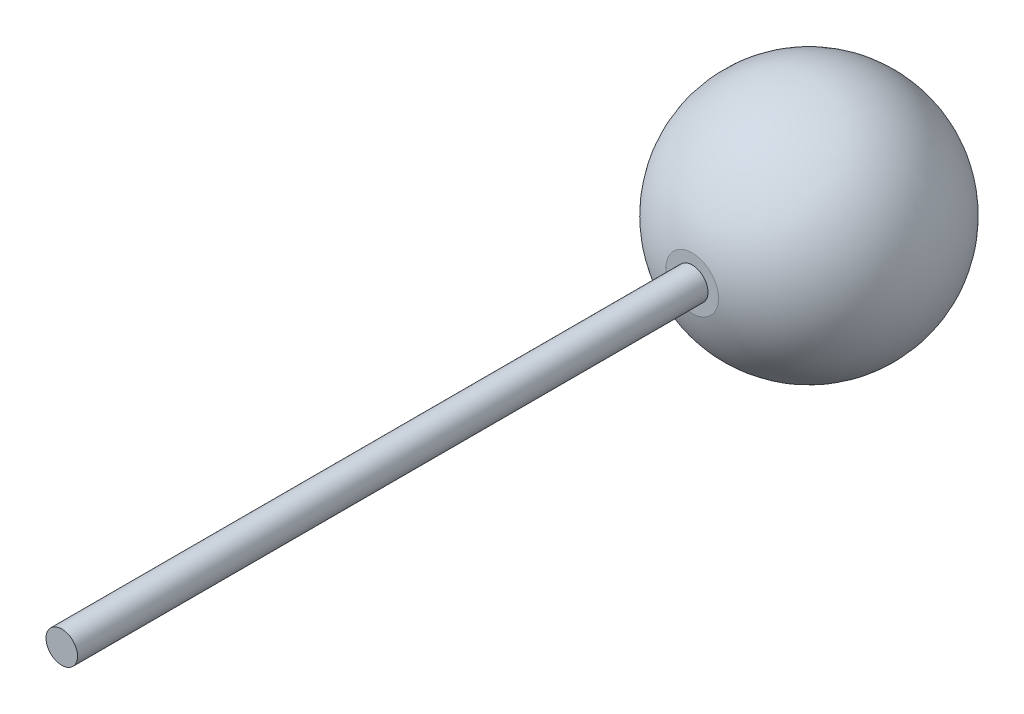
ISO-10303-21;
HEADER;
FILE_DESCRIPTION(('STEP AP214'),'2;1');
FILE_NAME('part.step','',(''),(''),'','','');
FILE_SCHEMA(('AUTOMOTIVE_DESIGN { 1 0 10303 214 1 1 1 1 }'));
ENDSEC;
DATA;
#1=APPLICATION_CONTEXT('core data for automotive mechanical design processes');
#2=APPLICATION_PROTOCOL_DEFINITION('international standard','automotive_design',2000,#1);
#3=PRODUCT_CONTEXT('',#1,'mechanical');
#4=PRODUCT('Part','Part','',(#3));
#5=PRODUCT_RELATED_PRODUCT_CATEGORY('part','',(#4));
#6=PRODUCT_DEFINITION_FORMATION('','',#4);
#7=PRODUCT_DEFINITION_CONTEXT('part definition',#1,'design');
#8=PRODUCT_DEFINITION('design','',#6,#7);
#9=PRODUCT_DEFINITION_SHAPE('','',#8);
#10=(LENGTH_UNIT() NAMED_UNIT(*) SI_UNIT(.MILLI.,.METRE.));
#11=(NAMED_UNIT(*) PLANE_ANGLE_UNIT() SI_UNIT($,.RADIAN.));
#12=(NAMED_UNIT(*) SI_UNIT($,.STERADIAN.) SOLID_ANGLE_UNIT());
#13=UNCERTAINTY_MEASURE_WITH_UNIT(LENGTH_MEASURE(1.E-05),#10,'distance_accuracy_value','');
#14=(GEOMETRIC_REPRESENTATION_CONTEXT(3) GLOBAL_UNCERTAINTY_ASSIGNED_CONTEXT((#13)) GLOBAL_UNIT_ASSIGNED_CONTEXT((#10,
#11,#12)) REPRESENTATION_CONTEXT('',''));
#15=CARTESIAN_POINT('',(0.,0.,0.));
#16=DIRECTION('',(0.,0.,1.));
#17=DIRECTION('',(1.,0.,0.));
#18=AXIS2_PLACEMENT_3D('',#15,#16,#17);
#19=CARTESIAN_POINT('',(0.000503654804633703,0.,-5.64438848279949));
#20=DIRECTION('',(0.,-1.,0.));
#21=DIRECTION('',(-1.,0.,0.));
#22=AXIS2_PLACEMENT_3D('',#19,#20,#21);
#23=CIRCLE('',#22,5.78561153912284);
#24=TRIMMED_CURVE('',#23,(PARAMETER_VALUE(-1.57070927380113)),
(PARAMETER_VALUE(1.57070927380113)),.T.,.PARAMETER.);
#25=CARTESIAN_POINT('',(0.,0.,-5.64438848279949));
#26=DIRECTION('',(0.,0.,-1.));
#27=AXIS1_PLACEMENT('',#25,#26);
#28=SURFACE_OF_REVOLUTION('',#24,#27);
#29=CARTESIAN_POINT('',(0.,0.,-11.43));
#30=VERTEX_POINT('',#29);
#31=VERTEX_LOOP('',#30);
#32=FACE_BOUND('',#31,.T.);
#33=CARTESIAN_POINT('',(0.,0.,0.));
#34=DIRECTION('',(0.,0.,-1.));
#35=DIRECTION('',(-1.,0.,0.));
#36=AXIS2_PLACEMENT_3D('',#33,#34,#35);
#37=CIRCLE('',#36,1.27);
#38=CARTESIAN_POINT('',(-1.27,0.,0.));
#39=VERTEX_POINT('',#38);
#40=EDGE_CURVE('E53',#39,#39,#37,.T.);
#41=ORIENTED_EDGE('',*,*,#40,.T.);
#42=EDGE_LOOP('',(#41));
#43=FACE_BOUND('',#42,.T.);
#44=ADVANCED_FACE('F47',(#32,#43),#28,.T.);
#45=CARTESIAN_POINT('',(0.,0.,0.));
#46=DIRECTION('',(0.,0.,-1.));
#47=DIRECTION('',(-1.,0.,0.));
#48=AXIS2_PLACEMENT_3D('',#45,#46,#47);
#49=PLANE('',#48);
#50=CARTESIAN_POINT('',(0.,0.,0.));
#51=DIRECTION('',(0.,0.,-1.));
#52=DIRECTION('',(-1.,0.,0.));
#53=AXIS2_PLACEMENT_3D('',#50,#51,#52);
#54=CIRCLE('',#53,0.762);
#55=CARTESIAN_POINT('',(-0.762,0.,0.));
#56=VERTEX_POINT('',#55);
#57=EDGE_CURVE('E11',#56,#56,#54,.F.);
#58=ORIENTED_EDGE('',*,*,#57,.F.);
#59=EDGE_LOOP('',(#58));
#60=FACE_BOUND('',#59,.T.);
#61=ORIENTED_EDGE('',*,*,#40,.F.);
#62=EDGE_LOOP('',(#61));
#63=FACE_BOUND('',#62,.T.);
#64=ADVANCED_FACE('F58',(#60,#63),#49,.F.);
#65=CARTESIAN_POINT('',(0.,0.,30.48));
#66=DIRECTION('',(0.,0.,-1.));
#67=DIRECTION('',(-1.,0.,0.));
#68=AXIS2_PLACEMENT_3D('',#65,#66,#67);
#69=CYLINDRICAL_SURFACE('',#68,0.762);
#70=CARTESIAN_POINT('',(0.,0.,30.48));
#71=DIRECTION('',(0.,0.,1.));
#72=DIRECTION('',(1.,0.,0.));
#73=AXIS2_PLACEMENT_3D('',#70,#71,#72);
#74=CIRCLE('',#73,0.762);
#75=CARTESIAN_POINT('',(-0.762,0.,30.48));
#76=VERTEX_POINT('',#75);
#77=EDGE_CURVE('E62',#76,#76,#74,.T.);
#78=CARTESIAN_POINT('',(-0.762,0.,30.48));
#79=CARTESIAN_POINT('',(-0.762,0.,30.1625));
#80=CARTESIAN_POINT('',(-0.762,0.,29.845));
#81=CARTESIAN_POINT('',(-0.762,0.,29.21));
#82=CARTESIAN_POINT('',(-0.762,0.,28.8925));
#83=CARTESIAN_POINT('',(-0.762,0.,28.2575));
#84=CARTESIAN_POINT('',(-0.762,0.,27.94));
#85=CARTESIAN_POINT('',(-0.762,0.,27.305));
#86=CARTESIAN_POINT('',(-0.762,0.,26.9875));
#87=CARTESIAN_POINT('',(-0.762,0.,26.3525));
#88=CARTESIAN_POINT('',(-0.762,0.,26.035));
#89=CARTESIAN_POINT('',(-0.762,0.,25.4));
#90=CARTESIAN_POINT('',(-0.762,0.,25.0825));
#91=CARTESIAN_POINT('',(-0.762,0.,24.4475));
#92=CARTESIAN_POINT('',(-0.762,0.,24.13));
#93=CARTESIAN_POINT('',(-0.762,0.,23.495));
#94=CARTESIAN_POINT('',(-0.762,0.,23.1775));
#95=CARTESIAN_POINT('',(-0.762,0.,22.5425));
#96=CARTESIAN_POINT('',(-0.762,0.,22.225));
#97=CARTESIAN_POINT('',(-0.762,0.,21.59));
#98=CARTESIAN_POINT('',(-0.762,0.,21.2725));
#99=CARTESIAN_POINT('',(-0.762,0.,20.6375));
#100=CARTESIAN_POINT('',(-0.762,0.,20.32));
#101=CARTESIAN_POINT('',(-0.762,0.,19.685));
#102=CARTESIAN_POINT('',(-0.762,0.,19.3675));
#103=CARTESIAN_POINT('',(-0.762,0.,18.7325));
#104=CARTESIAN_POINT('',(-0.762,0.,18.415));
#105=CARTESIAN_POINT('',(-0.762,0.,17.78));
#106=CARTESIAN_POINT('',(-0.762,0.,17.4625));
#107=CARTESIAN_POINT('',(-0.762,0.,16.8275));
#108=CARTESIAN_POINT('',(-0.762,0.,16.51));
#109=CARTESIAN_POINT('',(-0.762,0.,15.875));
#110=CARTESIAN_POINT('',(-0.762,0.,15.5575));
#111=CARTESIAN_POINT('',(-0.762,0.,14.9225));
#112=CARTESIAN_POINT('',(-0.762,0.,14.605));
#113=CARTESIAN_POINT('',(-0.762,0.,13.97));
#114=CARTESIAN_POINT('',(-0.762,0.,13.6525));
#115=CARTESIAN_POINT('',(-0.762,0.,13.0175));
#116=CARTESIAN_POINT('',(-0.762,0.,12.7));
#117=CARTESIAN_POINT('',(-0.762,0.,12.065));
#118=CARTESIAN_POINT('',(-0.762,0.,11.7475));
#119=CARTESIAN_POINT('',(-0.762,0.,11.1125));
#120=CARTESIAN_POINT('',(-0.762,0.,10.795));
#121=CARTESIAN_POINT('',(-0.762,0.,10.16));
#122=CARTESIAN_POINT('',(-0.762,0.,9.8425));
#123=CARTESIAN_POINT('',(-0.762,0.,9.2075));
#124=CARTESIAN_POINT('',(-0.762,0.,8.89));
#125=CARTESIAN_POINT('',(-0.762,0.,8.255));
#126=CARTESIAN_POINT('',(-0.762,0.,7.9375));
#127=CARTESIAN_POINT('',(-0.762,0.,7.3025));
#128=CARTESIAN_POINT('',(-0.762,0.,6.985));
#129=CARTESIAN_POINT('',(-0.762,0.,6.35));
#130=CARTESIAN_POINT('',(-0.762,0.,6.0325));
#131=CARTESIAN_POINT('',(-0.762,0.,5.3975));
#132=CARTESIAN_POINT('',(-0.762,0.,5.08));
#133=CARTESIAN_POINT('',(-0.762,0.,4.445));
#134=CARTESIAN_POINT('',(-0.762,0.,4.1275));
#135=CARTESIAN_POINT('',(-0.762,0.,3.4925));
#136=CARTESIAN_POINT('',(-0.762,0.,3.175));
#137=CARTESIAN_POINT('',(-0.762,0.,2.54));
#138=CARTESIAN_POINT('',(-0.762,0.,2.2225));
#139=CARTESIAN_POINT('',(-0.762,0.,1.5875));
#140=CARTESIAN_POINT('',(-0.762,0.,1.27));
#141=CARTESIAN_POINT('',(-0.762,0.,0.634999999999999));
#142=CARTESIAN_POINT('',(-0.762,0.,0.3175));
#143=CARTESIAN_POINT('',(-0.762,0.,0.));
#144=B_SPLINE_CURVE_WITH_KNOTS('',3,(#78,#79,#80,#81,#82,#83,#84,#85,#86,#87,#88,#89,#90,#91,
#92,#93,#94,#95,#96,#97,#98,#99,#100,#101,#102,#103,#104,#105,#106,#107,#108,#109,#110,#111,
#112,#113,#114,#115,#116,#117,#118,#119,#120,#121,#122,#123,#124,#125,#126,#127,#128,#129,#130,
#131,#132,#133,#134,#135,#136,#137,#138,#139,#140,#141,#142,#143),.UNSPECIFIED.,.F.,.F.,(4,2,2,
2,2,2,2,2,2,2,2,2,2,2,2,2,2,2,2,2,2,2,2,2,2,2,2,2,2,2,2,2,4),(0.,0.952499999999998,1.905,2.8575,
3.81,4.7625,5.715,6.6675,7.61999999999999,8.5725,9.525,10.4775,11.43,12.3825,13.335,14.2875,
15.24,16.1925,17.145,18.0975,19.05,20.0025,20.955,21.9075,22.86,23.8125,24.765,25.7175,26.67,
27.6225,28.575,29.5275,30.48),.UNSPECIFIED.);
#145=EDGE_CURVE('BSEAM69',#76,#56,#144,.T.);
#146=ORIENTED_EDGE('',*,*,#77,.F.);
#147=ORIENTED_EDGE('',*,*,#57,.T.);
#148=ORIENTED_EDGE('',*,*,#145,.T.);
#149=ORIENTED_EDGE('',*,*,#145,.F.);
#150=EDGE_LOOP('',(#146,#148,#147,#149));
#151=FACE_BOUND('',#150,.T.);
#152=ADVANCED_FACE('F69',(#151),#69,.T.);
#153=CARTESIAN_POINT('',(0.,0.,30.48));
#154=DIRECTION('',(0.,0.,1.));
#155=DIRECTION('',(1.,0.,0.));
#156=AXIS2_PLACEMENT_3D('',#153,#154,#155);
#157=PLANE('',#156);
#158=ORIENTED_EDGE('',*,*,#77,.T.);
#159=EDGE_LOOP('',(#158));
#160=FACE_BOUND('',#159,.T.);
#161=ADVANCED_FACE('F67',(#160),#157,.T.);
#162=CLOSED_SHELL('',(#44,#64,#152,#161));
#163=MANIFOLD_SOLID_BREP('B2',#162);
#164=ADVANCED_BREP_SHAPE_REPRESENTATION('',(#18,#163),#14);
#165=SHAPE_DEFINITION_REPRESENTATION(#9,#164);
ENDSEC;
END-ISO-10303-21;
